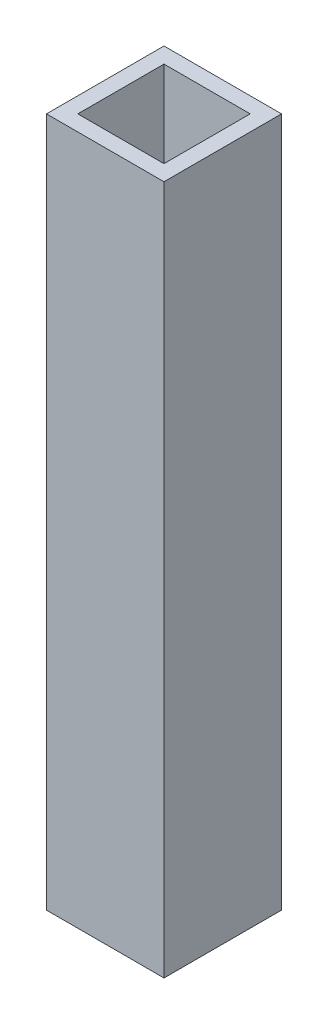
ISO-10303-21;
HEADER;
FILE_DESCRIPTION(('STEP AP214'),'2;1');
FILE_NAME('part.step','',(''),(''),'','','');
FILE_SCHEMA(('AUTOMOTIVE_DESIGN { 1 0 10303 214 1 1 1 1 }'));
ENDSEC;
DATA;
#1=APPLICATION_CONTEXT('core data for automotive mechanical design processes');
#2=APPLICATION_PROTOCOL_DEFINITION('international standard','automotive_design',2000,#1);
#3=PRODUCT_CONTEXT('',#1,'mechanical');
#4=PRODUCT('Part','Part','',(#3));
#5=PRODUCT_RELATED_PRODUCT_CATEGORY('part','',(#4));
#6=PRODUCT_DEFINITION_FORMATION('','',#4);
#7=PRODUCT_DEFINITION_CONTEXT('part definition',#1,'design');
#8=PRODUCT_DEFINITION('design','',#6,#7);
#9=PRODUCT_DEFINITION_SHAPE('','',#8);
#10=(LENGTH_UNIT() NAMED_UNIT(*) SI_UNIT(.MILLI.,.METRE.));
#11=(NAMED_UNIT(*) PLANE_ANGLE_UNIT() SI_UNIT($,.RADIAN.));
#12=(NAMED_UNIT(*) SI_UNIT($,.STERADIAN.) SOLID_ANGLE_UNIT());
#13=UNCERTAINTY_MEASURE_WITH_UNIT(LENGTH_MEASURE(1.E-05),#10,'distance_accuracy_value','');
#14=(GEOMETRIC_REPRESENTATION_CONTEXT(3) GLOBAL_UNCERTAINTY_ASSIGNED_CONTEXT((#13)) GLOBAL_UNIT_ASSIGNED_CONTEXT((#10,
#11,#12)) REPRESENTATION_CONTEXT('',''));
#15=CARTESIAN_POINT('',(0.,0.,0.));
#16=DIRECTION('',(0.,0.,1.));
#17=DIRECTION('',(1.,0.,0.));
#18=AXIS2_PLACEMENT_3D('',#15,#16,#17);
#19=CARTESIAN_POINT('',(0.,88.,0.));
#20=DIRECTION('',(0.,-1.,0.));
#21=DIRECTION('',(0.,0.,-1.));
#22=AXIS2_PLACEMENT_3D('',#19,#20,#21);
#23=PLANE('',#22);
#24=DIRECTION('',(0.,0.,1.));
#25=VECTOR('',#24,1.);
#26=CARTESIAN_POINT('',(0.,88.,0.));
#27=LINE('',#26,#25);
#28=CARTESIAN_POINT('',(0.,88.,-15.));
#29=VERTEX_POINT('',#28);
#30=CARTESIAN_POINT('',(0.,88.,0.));
#31=VERTEX_POINT('',#30);
#32=EDGE_CURVE('E157',#29,#31,#27,.T.);
#33=ORIENTED_EDGE('',*,*,#32,.T.);
#34=DIRECTION('',(1.,0.,0.));
#35=VECTOR('',#34,1.);
#36=CARTESIAN_POINT('',(0.,88.,0.));
#37=LINE('',#36,#35);
#38=CARTESIAN_POINT('',(15.,88.,0.));
#39=VERTEX_POINT('',#38);
#40=EDGE_CURVE('E161',#31,#39,#37,.T.);
#41=ORIENTED_EDGE('',*,*,#40,.T.);
#42=DIRECTION('',(0.,0.,-1.));
#43=VECTOR('',#42,1.);
#44=CARTESIAN_POINT('',(15.,88.,0.));
#45=LINE('',#44,#43);
#46=CARTESIAN_POINT('',(15.,88.,-15.));
#47=VERTEX_POINT('',#46);
#48=EDGE_CURVE('E165',#39,#47,#45,.T.);
#49=ORIENTED_EDGE('',*,*,#48,.T.);
#50=DIRECTION('',(-1.,0.,0.));
#51=VECTOR('',#50,1.);
#52=CARTESIAN_POINT('',(0.,88.,-15.));
#53=LINE('',#52,#51);
#54=EDGE_CURVE('E168',#47,#29,#53,.T.);
#55=ORIENTED_EDGE('',*,*,#54,.T.);
#56=EDGE_LOOP('',(#33,#41,#49,#55));
#57=FACE_BOUND('',#56,.T.);
#58=DIRECTION('',(1.,0.,0.));
#59=VECTOR('',#58,1.);
#60=CARTESIAN_POINT('',(2.,88.,-2.));
#61=LINE('',#60,#59);
#62=CARTESIAN_POINT('',(2.,88.,-2.));
#63=VERTEX_POINT('',#62);
#64=CARTESIAN_POINT('',(13.,88.,-2.));
#65=VERTEX_POINT('',#64);
#66=EDGE_CURVE('E109',#63,#65,#61,.T.);
#67=ORIENTED_EDGE('',*,*,#66,.F.);
#68=DIRECTION('',(0.,0.,1.));
#69=VECTOR('',#68,1.);
#70=CARTESIAN_POINT('',(2.,88.,-2.));
#71=LINE('',#70,#69);
#72=CARTESIAN_POINT('',(2.,88.,-13.));
#73=VERTEX_POINT('',#72);
#74=EDGE_CURVE('E135',#73,#63,#71,.T.);
#75=ORIENTED_EDGE('',*,*,#74,.F.);
#76=DIRECTION('',(-1.,0.,0.));
#77=VECTOR('',#76,1.);
#78=CARTESIAN_POINT('',(2.,88.,-13.));
#79=LINE('',#78,#77);
#80=CARTESIAN_POINT('',(13.,88.,-13.));
#81=VERTEX_POINT('',#80);
#82=EDGE_CURVE('E131',#81,#73,#79,.T.);
#83=ORIENTED_EDGE('',*,*,#82,.F.);
#84=DIRECTION('',(0.,0.,-1.));
#85=VECTOR('',#84,1.);
#86=CARTESIAN_POINT('',(13.,88.,-2.));
#87=LINE('',#86,#85);
#88=EDGE_CURVE('E118',#65,#81,#87,.T.);
#89=ORIENTED_EDGE('',*,*,#88,.F.);
#90=EDGE_LOOP('',(#67,#75,#83,#89));
#91=FACE_BOUND('',#90,.T.);
#92=ADVANCED_FACE('F43',(#57,#91),#23,.F.);
#93=CARTESIAN_POINT('',(0.,0.,0.));
#94=DIRECTION('',(0.,-1.,0.));
#95=DIRECTION('',(0.,0.,-1.));
#96=AXIS2_PLACEMENT_3D('',#93,#94,#95);
#97=PLANE('',#96);
#98=DIRECTION('',(0.,0.,1.));
#99=VECTOR('',#98,1.);
#100=CARTESIAN_POINT('',(0.,0.,0.));
#101=LINE('',#100,#99);
#102=CARTESIAN_POINT('',(0.,0.,-15.));
#103=VERTEX_POINT('',#102);
#104=CARTESIAN_POINT('',(0.,0.,0.));
#105=VERTEX_POINT('',#104);
#106=EDGE_CURVE('E127',#103,#105,#101,.T.);
#107=ORIENTED_EDGE('',*,*,#106,.F.);
#108=DIRECTION('',(-1.,0.,0.));
#109=VECTOR('',#108,1.);
#110=CARTESIAN_POINT('',(0.,0.,-15.));
#111=LINE('',#110,#109);
#112=CARTESIAN_POINT('',(15.,0.,-15.));
#113=VERTEX_POINT('',#112);
#114=EDGE_CURVE('E162',#113,#103,#111,.T.);
#115=ORIENTED_EDGE('',*,*,#114,.F.);
#116=DIRECTION('',(0.,0.,-1.));
#117=VECTOR('',#116,1.);
#118=CARTESIAN_POINT('',(15.,0.,0.));
#119=LINE('',#118,#117);
#120=CARTESIAN_POINT('',(15.,0.,0.));
#121=VERTEX_POINT('',#120);
#122=EDGE_CURVE('E178',#121,#113,#119,.T.);
#123=ORIENTED_EDGE('',*,*,#122,.F.);
#124=DIRECTION('',(1.,0.,0.));
#125=VECTOR('',#124,1.);
#126=CARTESIAN_POINT('',(0.,0.,0.));
#127=LINE('',#126,#125);
#128=EDGE_CURVE('E175',#105,#121,#127,.T.);
#129=ORIENTED_EDGE('',*,*,#128,.F.);
#130=EDGE_LOOP('',(#107,#115,#123,#129));
#131=FACE_BOUND('',#130,.T.);
#132=DIRECTION('',(0.,0.,1.));
#133=VECTOR('',#132,1.);
#134=CARTESIAN_POINT('',(2.,0.,-2.));
#135=LINE('',#134,#133);
#136=CARTESIAN_POINT('',(2.,0.,-13.));
#137=VERTEX_POINT('',#136);
#138=CARTESIAN_POINT('',(2.,0.,-2.));
#139=VERTEX_POINT('',#138);
#140=EDGE_CURVE('E119',#137,#139,#135,.T.);
#141=ORIENTED_EDGE('',*,*,#140,.T.);
#142=DIRECTION('',(1.,0.,0.));
#143=VECTOR('',#142,1.);
#144=CARTESIAN_POINT('',(2.,0.,-2.));
#145=LINE('',#144,#143);
#146=CARTESIAN_POINT('',(13.,0.,-2.));
#147=VERTEX_POINT('',#146);
#148=EDGE_CURVE('E67',#139,#147,#145,.T.);
#149=ORIENTED_EDGE('',*,*,#148,.T.);
#150=DIRECTION('',(0.,0.,-1.));
#151=VECTOR('',#150,1.);
#152=CARTESIAN_POINT('',(13.,0.,-2.));
#153=LINE('',#152,#151);
#154=CARTESIAN_POINT('',(13.,0.,-13.));
#155=VERTEX_POINT('',#154);
#156=EDGE_CURVE('E125',#147,#155,#153,.T.);
#157=ORIENTED_EDGE('',*,*,#156,.T.);
#158=DIRECTION('',(-1.,0.,0.));
#159=VECTOR('',#158,1.);
#160=CARTESIAN_POINT('',(2.,0.,-13.));
#161=LINE('',#160,#159);
#162=EDGE_CURVE('E144',#155,#137,#161,.T.);
#163=ORIENTED_EDGE('',*,*,#162,.T.);
#164=EDGE_LOOP('',(#141,#149,#157,#163));
#165=FACE_BOUND('',#164,.T.);
#166=ADVANCED_FACE('F201',(#131,#165),#97,.T.);
#167=CARTESIAN_POINT('',(0.,88.,0.));
#168=DIRECTION('',(1.,0.,0.));
#169=DIRECTION('',(0.,0.,-1.));
#170=AXIS2_PLACEMENT_3D('',#167,#168,#169);
#171=PLANE('',#170);
#172=ORIENTED_EDGE('',*,*,#106,.T.);
#173=DIRECTION('',(0.,-1.,0.));
#174=VECTOR('',#173,1.);
#175=CARTESIAN_POINT('',(0.,88.,0.));
#176=LINE('',#175,#174);
#177=EDGE_CURVE('E11',#31,#105,#176,.T.);
#178=ORIENTED_EDGE('',*,*,#177,.F.);
#179=ORIENTED_EDGE('',*,*,#32,.F.);
#180=DIRECTION('',(0.,-1.,0.));
#181=VECTOR('',#180,1.);
#182=CARTESIAN_POINT('',(0.,88.,-15.));
#183=LINE('',#182,#181);
#184=EDGE_CURVE('E171',#29,#103,#183,.T.);
#185=ORIENTED_EDGE('',*,*,#184,.T.);
#186=EDGE_LOOP('',(#172,#178,#179,#185));
#187=FACE_BOUND('',#186,.T.);
#188=ADVANCED_FACE('F45',(#187),#171,.F.);
#189=CARTESIAN_POINT('',(0.,88.,0.));
#190=DIRECTION('',(0.,0.,-1.));
#191=DIRECTION('',(-1.,0.,0.));
#192=AXIS2_PLACEMENT_3D('',#189,#190,#191);
#193=PLANE('',#192);
#194=ORIENTED_EDGE('',*,*,#128,.T.);
#195=DIRECTION('',(0.,-1.,0.));
#196=VECTOR('',#195,1.);
#197=CARTESIAN_POINT('',(15.,88.,0.));
#198=LINE('',#197,#196);
#199=EDGE_CURVE('E52',#39,#121,#198,.T.);
#200=ORIENTED_EDGE('',*,*,#199,.F.);
#201=ORIENTED_EDGE('',*,*,#40,.F.);
#202=ORIENTED_EDGE('',*,*,#177,.T.);
#203=EDGE_LOOP('',(#194,#200,#201,#202));
#204=FACE_BOUND('',#203,.T.);
#205=ADVANCED_FACE('F211',(#204),#193,.F.);
#206=CARTESIAN_POINT('',(15.,88.,0.));
#207=DIRECTION('',(-1.,0.,0.));
#208=DIRECTION('',(0.,0.,1.));
#209=AXIS2_PLACEMENT_3D('',#206,#207,#208);
#210=PLANE('',#209);
#211=ORIENTED_EDGE('',*,*,#122,.T.);
#212=DIRECTION('',(0.,-1.,0.));
#213=VECTOR('',#212,1.);
#214=CARTESIAN_POINT('',(15.,88.,-15.));
#215=LINE('',#214,#213);
#216=EDGE_CURVE('E186',#47,#113,#215,.T.);
#217=ORIENTED_EDGE('',*,*,#216,.F.);
#218=ORIENTED_EDGE('',*,*,#48,.F.);
#219=ORIENTED_EDGE('',*,*,#199,.T.);
#220=EDGE_LOOP('',(#211,#217,#218,#219));
#221=FACE_BOUND('',#220,.T.);
#222=ADVANCED_FACE('F195',(#221),#210,.F.);
#223=CARTESIAN_POINT('',(0.,88.,-15.));
#224=DIRECTION('',(0.,0.,1.));
#225=DIRECTION('',(1.,0.,0.));
#226=AXIS2_PLACEMENT_3D('',#223,#224,#225);
#227=PLANE('',#226);
#228=ORIENTED_EDGE('',*,*,#114,.T.);
#229=ORIENTED_EDGE('',*,*,#184,.F.);
#230=ORIENTED_EDGE('',*,*,#54,.F.);
#231=ORIENTED_EDGE('',*,*,#216,.T.);
#232=EDGE_LOOP('',(#228,#229,#230,#231));
#233=FACE_BOUND('',#232,.T.);
#234=ADVANCED_FACE('F205',(#233),#227,.F.);
#235=CARTESIAN_POINT('',(2.,88.,-2.));
#236=DIRECTION('',(0.,0.,-1.));
#237=DIRECTION('',(-1.,0.,0.));
#238=AXIS2_PLACEMENT_3D('',#235,#236,#237);
#239=PLANE('',#238);
#240=ORIENTED_EDGE('',*,*,#148,.F.);
#241=DIRECTION('',(0.,-1.,0.));
#242=VECTOR('',#241,1.);
#243=CARTESIAN_POINT('',(2.,88.,-2.));
#244=LINE('',#243,#242);
#245=EDGE_CURVE('E113',#63,#139,#244,.T.);
#246=ORIENTED_EDGE('',*,*,#245,.F.);
#247=ORIENTED_EDGE('',*,*,#66,.T.);
#248=DIRECTION('',(0.,-1.,0.));
#249=VECTOR('',#248,1.);
#250=CARTESIAN_POINT('',(13.,88.,-2.));
#251=LINE('',#250,#249);
#252=EDGE_CURVE('E112',#65,#147,#251,.T.);
#253=ORIENTED_EDGE('',*,*,#252,.T.);
#254=EDGE_LOOP('',(#240,#246,#247,#253));
#255=FACE_BOUND('',#254,.T.);
#256=ADVANCED_FACE('F111',(#255),#239,.T.);
#257=CARTESIAN_POINT('',(13.,88.,-2.));
#258=DIRECTION('',(-1.,0.,0.));
#259=DIRECTION('',(0.,0.,1.));
#260=AXIS2_PLACEMENT_3D('',#257,#258,#259);
#261=PLANE('',#260);
#262=ORIENTED_EDGE('',*,*,#156,.F.);
#263=ORIENTED_EDGE('',*,*,#252,.F.);
#264=ORIENTED_EDGE('',*,*,#88,.T.);
#265=DIRECTION('',(0.,-1.,0.));
#266=VECTOR('',#265,1.);
#267=CARTESIAN_POINT('',(13.,88.,-13.));
#268=LINE('',#267,#266);
#269=EDGE_CURVE('E128',#81,#155,#268,.T.);
#270=ORIENTED_EDGE('',*,*,#269,.T.);
#271=EDGE_LOOP('',(#262,#263,#264,#270));
#272=FACE_BOUND('',#271,.T.);
#273=ADVANCED_FACE('F122',(#272),#261,.T.);
#274=CARTESIAN_POINT('',(2.,88.,-13.));
#275=DIRECTION('',(0.,0.,1.));
#276=DIRECTION('',(1.,0.,0.));
#277=AXIS2_PLACEMENT_3D('',#274,#275,#276);
#278=PLANE('',#277);
#279=ORIENTED_EDGE('',*,*,#162,.F.);
#280=ORIENTED_EDGE('',*,*,#269,.F.);
#281=ORIENTED_EDGE('',*,*,#82,.T.);
#282=DIRECTION('',(0.,-1.,0.));
#283=VECTOR('',#282,1.);
#284=CARTESIAN_POINT('',(2.,88.,-13.));
#285=LINE('',#284,#283);
#286=EDGE_CURVE('E59',#73,#137,#285,.T.);
#287=ORIENTED_EDGE('',*,*,#286,.T.);
#288=EDGE_LOOP('',(#279,#280,#281,#287));
#289=FACE_BOUND('',#288,.T.);
#290=ADVANCED_FACE('F234',(#289),#278,.T.);
#291=CARTESIAN_POINT('',(2.,88.,-2.));
#292=DIRECTION('',(1.,0.,0.));
#293=DIRECTION('',(0.,0.,-1.));
#294=AXIS2_PLACEMENT_3D('',#291,#292,#293);
#295=PLANE('',#294);
#296=ORIENTED_EDGE('',*,*,#140,.F.);
#297=ORIENTED_EDGE('',*,*,#286,.F.);
#298=ORIENTED_EDGE('',*,*,#74,.T.);
#299=ORIENTED_EDGE('',*,*,#245,.T.);
#300=EDGE_LOOP('',(#296,#297,#298,#299));
#301=FACE_BOUND('',#300,.T.);
#302=ADVANCED_FACE('F238',(#301),#295,.T.);
#303=CLOSED_SHELL('',(#92,#166,#188,#205,#222,#234,#256,#273,#290,#302));
#304=MANIFOLD_SOLID_BREP('B2',#303);
#305=ADVANCED_BREP_SHAPE_REPRESENTATION('',(#18,#304),#14);
#306=SHAPE_DEFINITION_REPRESENTATION(#9,#305);
ENDSEC;
END-ISO-10303-21;
